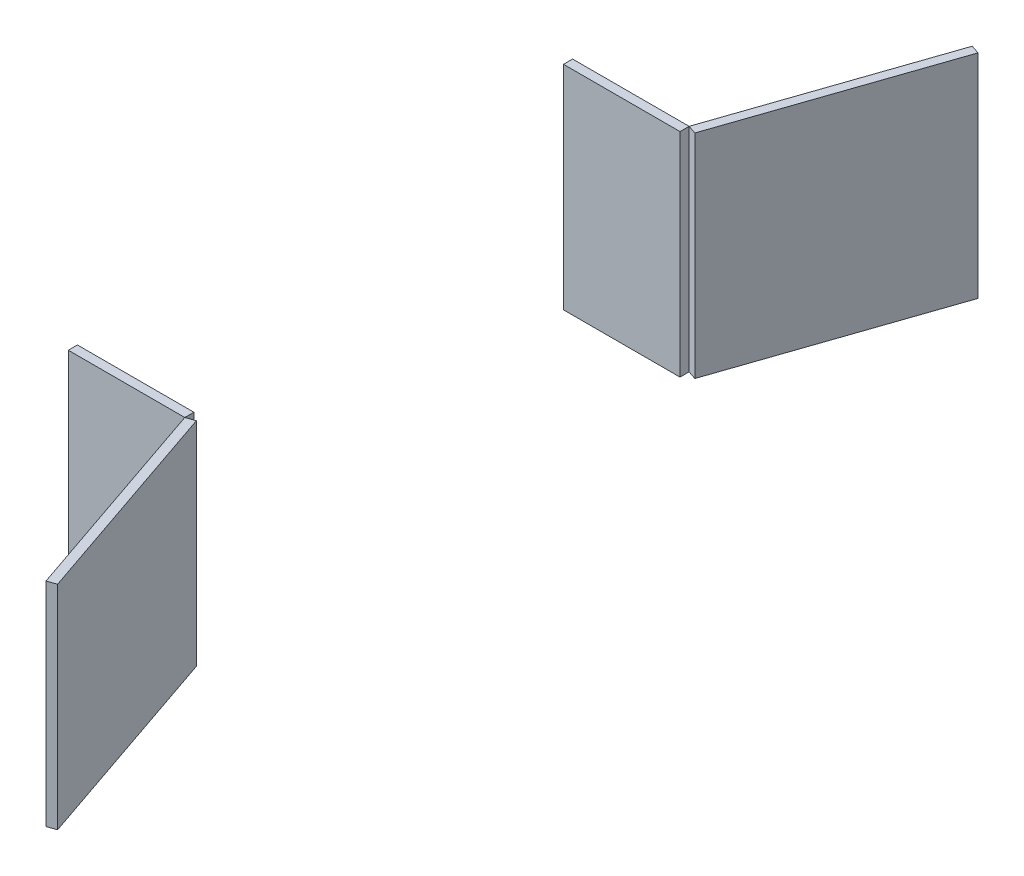
ISO-10303-21;
HEADER;
FILE_DESCRIPTION(('STEP AP214'),'2;1');
FILE_NAME('part.step','',(''),(''),'','','');
FILE_SCHEMA(('AUTOMOTIVE_DESIGN { 1 0 10303 214 1 1 1 1 }'));
ENDSEC;
DATA;
#1=APPLICATION_CONTEXT('core data for automotive mechanical design processes');
#2=APPLICATION_PROTOCOL_DEFINITION('international standard','automotive_design',2000,#1);
#3=PRODUCT_CONTEXT('',#1,'mechanical');
#4=PRODUCT('Part','Part','',(#3));
#5=PRODUCT_RELATED_PRODUCT_CATEGORY('part','',(#4));
#6=PRODUCT_DEFINITION_FORMATION('','',#4);
#7=PRODUCT_DEFINITION_CONTEXT('part definition',#1,'design');
#8=PRODUCT_DEFINITION('design','',#6,#7);
#9=PRODUCT_DEFINITION_SHAPE('','',#8);
#10=(LENGTH_UNIT() NAMED_UNIT(*) SI_UNIT(.MILLI.,.METRE.));
#11=(NAMED_UNIT(*) PLANE_ANGLE_UNIT() SI_UNIT($,.RADIAN.));
#12=(NAMED_UNIT(*) SI_UNIT($,.STERADIAN.) SOLID_ANGLE_UNIT());
#13=UNCERTAINTY_MEASURE_WITH_UNIT(LENGTH_MEASURE(1.E-05),#10,'distance_accuracy_value','');
#14=(GEOMETRIC_REPRESENTATION_CONTEXT(3) GLOBAL_UNCERTAINTY_ASSIGNED_CONTEXT((#13)) GLOBAL_UNIT_ASSIGNED_CONTEXT((#10,
#11,#12)) REPRESENTATION_CONTEXT('',''));
#15=CARTESIAN_POINT('',(0.,0.,0.));
#16=DIRECTION('',(0.,0.,1.));
#17=DIRECTION('',(1.,0.,0.));
#18=AXIS2_PLACEMENT_3D('',#15,#16,#17);
#19=CARTESIAN_POINT('',(-22.5855543490904,70.,-7.72827847580449));
#20=DIRECTION('',(0.946142923389947,0.,0.323749237094274));
#21=DIRECTION('',(0.323749237094274,0.,-0.946142923389947));
#22=AXIS2_PLACEMENT_3D('',#19,#20,#21);
#23=PLANE('',#22);
#24=DIRECTION('',(-0.323749237094274,0.,0.946142923389947));
#25=VECTOR('',#24,1.);
#26=CARTESIAN_POINT('',(-22.5855543490904,0.,-7.72827847580449));
#27=LINE('',#26,#25);
#28=CARTESIAN_POINT('',(26.6026867489092,0.,-151.478752288717));
#29=VERTEX_POINT('',#28);
#30=CARTESIAN_POINT('',(2.83842877016985,0.,-82.0287522887172));
#31=VERTEX_POINT('',#30);
#32=EDGE_CURVE('E163',#29,#31,#27,.T.);
#33=ORIENTED_EDGE('',*,*,#32,.F.);
#34=DIRECTION('',(0.,-1.,0.));
#35=VECTOR('',#34,1.);
#36=CARTESIAN_POINT('',(26.6026867489092,70.,-151.478752288717));
#37=LINE('',#36,#35);
#38=CARTESIAN_POINT('',(26.6026867489092,70.,-151.478752288717));
#39=VERTEX_POINT('',#38);
#40=EDGE_CURVE('E13',#39,#29,#37,.T.);
#41=ORIENTED_EDGE('',*,*,#40,.F.);
#42=DIRECTION('',(-0.323749237094274,0.,0.946142923389947));
#43=VECTOR('',#42,1.);
#44=CARTESIAN_POINT('',(-22.5855543490904,70.,-7.72827847580449));
#45=LINE('',#44,#43);
#46=CARTESIAN_POINT('',(2.83842877016985,70.,-82.0287522887172));
#47=VERTEX_POINT('',#46);
#48=EDGE_CURVE('E157',#39,#47,#45,.T.);
#49=ORIENTED_EDGE('',*,*,#48,.T.);
#50=DIRECTION('',(0.,-1.,0.));
#51=VECTOR('',#50,1.);
#52=CARTESIAN_POINT('',(2.83842877016985,70.,-82.0287522887172));
#53=LINE('',#52,#51);
#54=EDGE_CURVE('E138',#47,#31,#53,.T.);
#55=ORIENTED_EDGE('',*,*,#54,.T.);
#56=EDGE_LOOP('',(#33,#41,#49,#55));
#57=FACE_BOUND('',#56,.T.);
#58=ADVANCED_FACE('F100',(#57),#23,.T.);
#59=CARTESIAN_POINT('',(49.1882410979995,70.,-143.750473812913));
#60=DIRECTION('',(0.323749237094273,0.,-0.946142923389948));
#61=DIRECTION('',(-0.946142923389948,0.,-0.323749237094273));
#62=AXIS2_PLACEMENT_3D('',#59,#60,#61);
#63=PLANE('',#62);
#64=DIRECTION('',(0.946142923389948,0.,0.323749237094273));
#65=VECTOR('',#64,1.);
#66=CARTESIAN_POINT('',(49.1882410979995,0.,-143.750473812913));
#67=LINE('',#66,#65);
#68=CARTESIAN_POINT('',(23.7642579787393,0.,-152.45));
#69=VERTEX_POINT('',#68);
#70=EDGE_CURVE('E151',#69,#29,#67,.T.);
#71=ORIENTED_EDGE('',*,*,#70,.F.);
#72=DIRECTION('',(0.,-1.,0.));
#73=VECTOR('',#72,1.);
#74=CARTESIAN_POINT('',(23.7642579787393,70.,-152.45));
#75=LINE('',#74,#73);
#76=CARTESIAN_POINT('',(23.7642579787393,70.,-152.45));
#77=VERTEX_POINT('',#76);
#78=EDGE_CURVE('E108',#77,#69,#75,.T.);
#79=ORIENTED_EDGE('',*,*,#78,.F.);
#80=DIRECTION('',(0.946142923389948,0.,0.323749237094273));
#81=VECTOR('',#80,1.);
#82=CARTESIAN_POINT('',(49.1882410979995,70.,-143.750473812913));
#83=LINE('',#82,#81);
#84=EDGE_CURVE('E149',#77,#39,#83,.T.);
#85=ORIENTED_EDGE('',*,*,#84,.T.);
#86=ORIENTED_EDGE('',*,*,#40,.T.);
#87=EDGE_LOOP('',(#71,#79,#85,#86));
#88=FACE_BOUND('',#87,.T.);
#89=ADVANCED_FACE('F147',(#88),#63,.T.);
#90=CARTESIAN_POINT('',(-25.4239831192602,70.,-8.69952618708731));
#91=DIRECTION('',(0.946142923389947,0.,0.323749237094274));
#92=DIRECTION('',(0.323749237094274,0.,-0.946142923389947));
#93=AXIS2_PLACEMENT_3D('',#90,#91,#92);
#94=PLANE('',#93);
#95=DIRECTION('',(-0.323749237094274,0.,0.946142923389947));
#96=VECTOR('',#95,1.);
#97=CARTESIAN_POINT('',(-25.4239831192602,0.,-8.69952618708731));
#98=LINE('',#97,#96);
#99=CARTESIAN_POINT('',(0.,0.,-83.));
#100=VERTEX_POINT('',#99);
#101=EDGE_CURVE('E131',#69,#100,#98,.T.);
#102=ORIENTED_EDGE('',*,*,#101,.T.);
#103=DIRECTION('',(0.,-1.,0.));
#104=VECTOR('',#103,1.);
#105=CARTESIAN_POINT('',(0.,70.,-83.));
#106=LINE('',#105,#104);
#107=CARTESIAN_POINT('',(0.,70.,-83.));
#108=VERTEX_POINT('',#107);
#109=EDGE_CURVE('E152',#108,#100,#106,.T.);
#110=ORIENTED_EDGE('',*,*,#109,.F.);
#111=DIRECTION('',(-0.323749237094274,0.,0.946142923389947));
#112=VECTOR('',#111,1.);
#113=CARTESIAN_POINT('',(-25.4239831192602,70.,-8.69952618708731));
#114=LINE('',#113,#112);
#115=EDGE_CURVE('E153',#77,#108,#114,.T.);
#116=ORIENTED_EDGE('',*,*,#115,.F.);
#117=ORIENTED_EDGE('',*,*,#78,.T.);
#118=EDGE_LOOP('',(#102,#110,#116,#117));
#119=FACE_BOUND('',#118,.T.);
#120=ADVANCED_FACE('F154',(#119),#94,.F.);
#121=CARTESIAN_POINT('',(25.4239831192599,70.,-74.300473812913));
#122=DIRECTION('',(0.323749237094269,0.,-0.946142923389949));
#123=DIRECTION('',(-0.946142923389949,0.,-0.323749237094269));
#124=AXIS2_PLACEMENT_3D('',#121,#122,#123);
#125=PLANE('',#124);
#126=DIRECTION('',(0.946142923389949,0.,0.323749237094269));
#127=VECTOR('',#126,1.);
#128=CARTESIAN_POINT('',(25.4239831192599,0.,-74.300473812913));
#129=LINE('',#128,#127);
#130=EDGE_CURVE('E159',#100,#31,#129,.T.);
#131=ORIENTED_EDGE('',*,*,#130,.T.);
#132=ORIENTED_EDGE('',*,*,#54,.F.);
#133=DIRECTION('',(0.946142923389949,0.,0.323749237094269));
#134=VECTOR('',#133,1.);
#135=CARTESIAN_POINT('',(25.4239831192599,70.,-74.300473812913));
#136=LINE('',#135,#134);
#137=EDGE_CURVE('E116',#108,#47,#136,.T.);
#138=ORIENTED_EDGE('',*,*,#137,.F.);
#139=ORIENTED_EDGE('',*,*,#109,.T.);
#140=EDGE_LOOP('',(#131,#132,#138,#139));
#141=FACE_BOUND('',#140,.T.);
#142=ADVANCED_FACE('F172',(#141),#125,.F.);
#143=CARTESIAN_POINT('',(0.,70.,0.));
#144=DIRECTION('',(0.,1.,0.));
#145=DIRECTION('',(0.,0.,1.));
#146=AXIS2_PLACEMENT_3D('',#143,#144,#145);
#147=PLANE('',#146);
#148=ORIENTED_EDGE('',*,*,#48,.F.);
#149=ORIENTED_EDGE('',*,*,#84,.F.);
#150=ORIENTED_EDGE('',*,*,#115,.T.);
#151=ORIENTED_EDGE('',*,*,#137,.T.);
#152=EDGE_LOOP('',(#148,#149,#150,#151));
#153=FACE_BOUND('',#152,.T.);
#154=ADVANCED_FACE('F156',(#153),#147,.T.);
#155=CARTESIAN_POINT('',(0.,0.,0.));
#156=DIRECTION('',(0.,1.,0.));
#157=DIRECTION('',(0.,0.,1.));
#158=AXIS2_PLACEMENT_3D('',#155,#156,#157);
#159=PLANE('',#158);
#160=ORIENTED_EDGE('',*,*,#32,.T.);
#161=ORIENTED_EDGE('',*,*,#130,.F.);
#162=ORIENTED_EDGE('',*,*,#101,.F.);
#163=ORIENTED_EDGE('',*,*,#70,.T.);
#164=EDGE_LOOP('',(#160,#161,#162,#163));
#165=FACE_BOUND('',#164,.T.);
#166=ADVANCED_FACE('F174',(#165),#159,.F.);
#167=CLOSED_SHELL('',(#58,#89,#120,#142,#154,#166));
#168=MANIFOLD_SOLID_BREP('B2',#167);
#169=CARTESIAN_POINT('',(-4.71609870983756E-13,70.,0.));
#170=DIRECTION('',(1.,0.,0.));
#171=DIRECTION('',(0.,0.,-1.));
#172=AXIS2_PLACEMENT_3D('',#169,#170,#171);
#173=PLANE('',#172);
#174=DIRECTION('',(0.,0.,1.));
#175=VECTOR('',#174,1.);
#176=CARTESIAN_POINT('',(-4.71609870983756E-13,0.,0.));
#177=LINE('',#176,#175);
#178=CARTESIAN_POINT('',(0.,0.,-83.));
#179=VERTEX_POINT('',#178);
#180=CARTESIAN_POINT('',(0.,0.,-80.));
#181=VERTEX_POINT('',#180);
#182=EDGE_CURVE('E297',#179,#181,#177,.T.);
#183=ORIENTED_EDGE('',*,*,#182,.F.);
#184=DIRECTION('',(0.,-1.,0.));
#185=VECTOR('',#184,1.);
#186=CARTESIAN_POINT('',(0.,70.,-83.));
#187=LINE('',#186,#185);
#188=CARTESIAN_POINT('',(0.,70.,-83.));
#189=VERTEX_POINT('',#188);
#190=EDGE_CURVE('E98',#189,#179,#187,.T.);
#191=ORIENTED_EDGE('',*,*,#190,.F.);
#192=DIRECTION('',(0.,0.,1.));
#193=VECTOR('',#192,1.);
#194=CARTESIAN_POINT('',(-4.71609870983756E-13,70.,0.));
#195=LINE('',#194,#193);
#196=CARTESIAN_POINT('',(0.,70.,-80.));
#197=VERTEX_POINT('',#196);
#198=EDGE_CURVE('E291',#189,#197,#195,.T.);
#199=ORIENTED_EDGE('',*,*,#198,.T.);
#200=DIRECTION('',(0.,-1.,0.));
#201=VECTOR('',#200,1.);
#202=CARTESIAN_POINT('',(0.,70.,-80.));
#203=LINE('',#202,#201);
#204=EDGE_CURVE('E272',#197,#181,#203,.T.);
#205=ORIENTED_EDGE('',*,*,#204,.T.);
#206=EDGE_LOOP('',(#183,#191,#199,#205));
#207=FACE_BOUND('',#206,.T.);
#208=ADVANCED_FACE('F234',(#207),#173,.T.);
#209=CARTESIAN_POINT('',(0.,70.,-83.));
#210=DIRECTION('',(0.,0.,-1.));
#211=DIRECTION('',(-1.,0.,0.));
#212=AXIS2_PLACEMENT_3D('',#209,#210,#211);
#213=PLANE('',#212);
#214=DIRECTION('',(1.,0.,0.));
#215=VECTOR('',#214,1.);
#216=CARTESIAN_POINT('',(0.,0.,-83.));
#217=LINE('',#216,#215);
#218=CARTESIAN_POINT('',(-38.357380244156,0.,-83.));
#219=VERTEX_POINT('',#218);
#220=EDGE_CURVE('E285',#219,#179,#217,.T.);
#221=ORIENTED_EDGE('',*,*,#220,.F.);
#222=DIRECTION('',(0.,-1.,0.));
#223=VECTOR('',#222,1.);
#224=CARTESIAN_POINT('',(-38.357380244156,70.,-83.));
#225=LINE('',#224,#223);
#226=CARTESIAN_POINT('',(-38.357380244156,70.,-83.));
#227=VERTEX_POINT('',#226);
#228=EDGE_CURVE('E242',#227,#219,#225,.T.);
#229=ORIENTED_EDGE('',*,*,#228,.F.);
#230=DIRECTION('',(1.,0.,0.));
#231=VECTOR('',#230,1.);
#232=CARTESIAN_POINT('',(0.,70.,-83.));
#233=LINE('',#232,#231);
#234=EDGE_CURVE('E283',#227,#189,#233,.T.);
#235=ORIENTED_EDGE('',*,*,#234,.T.);
#236=ORIENTED_EDGE('',*,*,#190,.T.);
#237=EDGE_LOOP('',(#221,#229,#235,#236));
#238=FACE_BOUND('',#237,.T.);
#239=ADVANCED_FACE('F281',(#238),#213,.T.);
#240=CARTESIAN_POINT('',(-38.3573802441562,70.,0.));
#241=DIRECTION('',(1.,0.,0.));
#242=DIRECTION('',(0.,0.,-1.));
#243=AXIS2_PLACEMENT_3D('',#240,#241,#242);
#244=PLANE('',#243);
#245=DIRECTION('',(0.,0.,1.));
#246=VECTOR('',#245,1.);
#247=CARTESIAN_POINT('',(-38.3573802441562,0.,0.));
#248=LINE('',#247,#246);
#249=CARTESIAN_POINT('',(-38.357380244156,0.,-80.));
#250=VERTEX_POINT('',#249);
#251=EDGE_CURVE('E265',#219,#250,#248,.T.);
#252=ORIENTED_EDGE('',*,*,#251,.T.);
#253=DIRECTION('',(0.,-1.,0.));
#254=VECTOR('',#253,1.);
#255=CARTESIAN_POINT('',(-38.357380244156,70.,-80.));
#256=LINE('',#255,#254);
#257=CARTESIAN_POINT('',(-38.357380244156,70.,-80.));
#258=VERTEX_POINT('',#257);
#259=EDGE_CURVE('E286',#258,#250,#256,.T.);
#260=ORIENTED_EDGE('',*,*,#259,.F.);
#261=DIRECTION('',(0.,0.,1.));
#262=VECTOR('',#261,1.);
#263=CARTESIAN_POINT('',(-38.3573802441562,70.,0.));
#264=LINE('',#263,#262);
#265=EDGE_CURVE('E287',#227,#258,#264,.T.);
#266=ORIENTED_EDGE('',*,*,#265,.F.);
#267=ORIENTED_EDGE('',*,*,#228,.T.);
#268=EDGE_LOOP('',(#252,#260,#266,#267));
#269=FACE_BOUND('',#268,.T.);
#270=ADVANCED_FACE('F288',(#269),#244,.F.);
#271=CARTESIAN_POINT('',(0.,70.,-80.));
#272=DIRECTION('',(0.,0.,-1.));
#273=DIRECTION('',(-1.,0.,0.));
#274=AXIS2_PLACEMENT_3D('',#271,#272,#273);
#275=PLANE('',#274);
#276=DIRECTION('',(1.,0.,0.));
#277=VECTOR('',#276,1.);
#278=CARTESIAN_POINT('',(0.,0.,-80.));
#279=LINE('',#278,#277);
#280=EDGE_CURVE('E293',#250,#181,#279,.T.);
#281=ORIENTED_EDGE('',*,*,#280,.T.);
#282=ORIENTED_EDGE('',*,*,#204,.F.);
#283=DIRECTION('',(1.,0.,0.));
#284=VECTOR('',#283,1.);
#285=CARTESIAN_POINT('',(0.,70.,-80.));
#286=LINE('',#285,#284);
#287=EDGE_CURVE('E250',#258,#197,#286,.T.);
#288=ORIENTED_EDGE('',*,*,#287,.F.);
#289=ORIENTED_EDGE('',*,*,#259,.T.);
#290=EDGE_LOOP('',(#281,#282,#288,#289));
#291=FACE_BOUND('',#290,.T.);
#292=ADVANCED_FACE('F306',(#291),#275,.F.);
#293=CARTESIAN_POINT('',(0.,70.,0.));
#294=DIRECTION('',(0.,1.,0.));
#295=DIRECTION('',(0.,0.,1.));
#296=AXIS2_PLACEMENT_3D('',#293,#294,#295);
#297=PLANE('',#296);
#298=ORIENTED_EDGE('',*,*,#198,.F.);
#299=ORIENTED_EDGE('',*,*,#234,.F.);
#300=ORIENTED_EDGE('',*,*,#265,.T.);
#301=ORIENTED_EDGE('',*,*,#287,.T.);
#302=EDGE_LOOP('',(#298,#299,#300,#301));
#303=FACE_BOUND('',#302,.T.);
#304=ADVANCED_FACE('F290',(#303),#297,.T.);
#305=CARTESIAN_POINT('',(0.,0.,0.));
#306=DIRECTION('',(0.,1.,0.));
#307=DIRECTION('',(0.,0.,1.));
#308=AXIS2_PLACEMENT_3D('',#305,#306,#307);
#309=PLANE('',#308);
#310=ORIENTED_EDGE('',*,*,#182,.T.);
#311=ORIENTED_EDGE('',*,*,#280,.F.);
#312=ORIENTED_EDGE('',*,*,#251,.F.);
#313=ORIENTED_EDGE('',*,*,#220,.T.);
#314=EDGE_LOOP('',(#310,#311,#312,#313));
#315=FACE_BOUND('',#314,.T.);
#316=ADVANCED_FACE('F308',(#315),#309,.F.);
#317=CLOSED_SHELL('',(#208,#239,#270,#292,#304,#316));
#318=MANIFOLD_SOLID_BREP('B7',#317);
#319=CARTESIAN_POINT('',(49.1882410979994,70.,143.750473812913));
#320=DIRECTION('',(0.323749237094272,0.,0.946142923389948));
#321=DIRECTION('',(0.946142923389948,0.,-0.323749237094272));
#322=AXIS2_PLACEMENT_3D('',#319,#320,#321);
#323=PLANE('',#322);
#324=DIRECTION('',(-0.946142923389948,0.,0.323749237094272));
#325=VECTOR('',#324,1.);
#326=CARTESIAN_POINT('',(49.1882410979994,0.,143.750473812913));
#327=LINE('',#326,#325);
#328=CARTESIAN_POINT('',(26.6026867489092,0.,151.478752288717));
#329=VERTEX_POINT('',#328);
#330=CARTESIAN_POINT('',(23.7642579787393,0.,152.45));
#331=VERTEX_POINT('',#330);
#332=EDGE_CURVE('E430',#329,#331,#327,.T.);
#333=ORIENTED_EDGE('',*,*,#332,.F.);
#334=DIRECTION('',(0.,-1.,0.));
#335=VECTOR('',#334,1.);
#336=CARTESIAN_POINT('',(26.6026867489092,70.,151.478752288717));
#337=LINE('',#336,#335);
#338=CARTESIAN_POINT('',(26.6026867489092,70.,151.478752288717));
#339=VERTEX_POINT('',#338);
#340=EDGE_CURVE('E232',#339,#329,#337,.T.);
#341=ORIENTED_EDGE('',*,*,#340,.F.);
#342=DIRECTION('',(-0.946142923389948,0.,0.323749237094272));
#343=VECTOR('',#342,1.);
#344=CARTESIAN_POINT('',(49.1882410979994,70.,143.750473812913));
#345=LINE('',#344,#343);
#346=CARTESIAN_POINT('',(23.7642579787393,70.,152.45));
#347=VERTEX_POINT('',#346);
#348=EDGE_CURVE('E424',#339,#347,#345,.T.);
#349=ORIENTED_EDGE('',*,*,#348,.T.);
#350=DIRECTION('',(0.,-1.,0.));
#351=VECTOR('',#350,1.);
#352=CARTESIAN_POINT('',(23.7642579787393,70.,152.45));
#353=LINE('',#352,#351);
#354=EDGE_CURVE('E405',#347,#331,#353,.T.);
#355=ORIENTED_EDGE('',*,*,#354,.T.);
#356=EDGE_LOOP('',(#333,#341,#349,#355));
#357=FACE_BOUND('',#356,.T.);
#358=ADVANCED_FACE('F367',(#357),#323,.T.);
#359=CARTESIAN_POINT('',(-22.5855543490903,70.,7.72827847580447));
#360=DIRECTION('',(0.946142923389947,0.,-0.323749237094274));
#361=DIRECTION('',(-0.323749237094274,0.,-0.946142923389948));
#362=AXIS2_PLACEMENT_3D('',#359,#360,#361);
#363=PLANE('',#362);
#364=DIRECTION('',(0.323749237094274,0.,0.946142923389948));
#365=VECTOR('',#364,1.);
#366=CARTESIAN_POINT('',(-22.5855543490903,0.,7.72827847580447));
#367=LINE('',#366,#365);
#368=CARTESIAN_POINT('',(2.83842877016988,0.,82.0287522887172));
#369=VERTEX_POINT('',#368);
#370=EDGE_CURVE('E418',#369,#329,#367,.T.);
#371=ORIENTED_EDGE('',*,*,#370,.F.);
#372=DIRECTION('',(0.,-1.,0.));
#373=VECTOR('',#372,1.);
#374=CARTESIAN_POINT('',(2.83842877016988,70.,82.0287522887172));
#375=LINE('',#374,#373);
#376=CARTESIAN_POINT('',(2.83842877016988,70.,82.0287522887172));
#377=VERTEX_POINT('',#376);
#378=EDGE_CURVE('E375',#377,#369,#375,.T.);
#379=ORIENTED_EDGE('',*,*,#378,.F.);
#380=DIRECTION('',(0.323749237094274,0.,0.946142923389948));
#381=VECTOR('',#380,1.);
#382=CARTESIAN_POINT('',(-22.5855543490903,70.,7.72827847580447));
#383=LINE('',#382,#381);
#384=EDGE_CURVE('E416',#377,#339,#383,.T.);
#385=ORIENTED_EDGE('',*,*,#384,.T.);
#386=ORIENTED_EDGE('',*,*,#340,.T.);
#387=EDGE_LOOP('',(#371,#379,#385,#386));
#388=FACE_BOUND('',#387,.T.);
#389=ADVANCED_FACE('F414',(#388),#363,.T.);
#390=CARTESIAN_POINT('',(25.4239831192605,70.,74.3004738129125));
#391=DIRECTION('',(0.323749237094277,0.,0.946142923389946));
#392=DIRECTION('',(0.946142923389946,0.,-0.323749237094277));
#393=AXIS2_PLACEMENT_3D('',#390,#391,#392);
#394=PLANE('',#393);
#395=DIRECTION('',(-0.946142923389946,0.,0.323749237094277));
#396=VECTOR('',#395,1.);
#397=CARTESIAN_POINT('',(25.4239831192605,0.,74.3004738129125));
#398=LINE('',#397,#396);
#399=CARTESIAN_POINT('',(0.,0.,83.));
#400=VERTEX_POINT('',#399);
#401=EDGE_CURVE('E398',#369,#400,#398,.T.);
#402=ORIENTED_EDGE('',*,*,#401,.T.);
#403=DIRECTION('',(0.,-1.,0.));
#404=VECTOR('',#403,1.);
#405=CARTESIAN_POINT('',(0.,70.,83.));
#406=LINE('',#405,#404);
#407=CARTESIAN_POINT('',(0.,70.,83.));
#408=VERTEX_POINT('',#407);
#409=EDGE_CURVE('E419',#408,#400,#406,.T.);
#410=ORIENTED_EDGE('',*,*,#409,.F.);
#411=DIRECTION('',(-0.946142923389946,0.,0.323749237094277));
#412=VECTOR('',#411,1.);
#413=CARTESIAN_POINT('',(25.4239831192605,70.,74.3004738129125));
#414=LINE('',#413,#412);
#415=EDGE_CURVE('E420',#377,#408,#414,.T.);
#416=ORIENTED_EDGE('',*,*,#415,.F.);
#417=ORIENTED_EDGE('',*,*,#378,.T.);
#418=EDGE_LOOP('',(#402,#410,#416,#417));
#419=FACE_BOUND('',#418,.T.);
#420=ADVANCED_FACE('F421',(#419),#394,.F.);
#421=CARTESIAN_POINT('',(-25.4239831192602,70.,8.69952618708729));
#422=DIRECTION('',(0.946142923389947,0.,-0.323749237094274));
#423=DIRECTION('',(-0.323749237094274,0.,-0.946142923389948));
#424=AXIS2_PLACEMENT_3D('',#421,#422,#423);
#425=PLANE('',#424);
#426=DIRECTION('',(0.323749237094274,0.,0.946142923389948));
#427=VECTOR('',#426,1.);
#428=CARTESIAN_POINT('',(-25.4239831192602,0.,8.69952618708729));
#429=LINE('',#428,#427);
#430=EDGE_CURVE('E426',#400,#331,#429,.T.);
#431=ORIENTED_EDGE('',*,*,#430,.T.);
#432=ORIENTED_EDGE('',*,*,#354,.F.);
#433=DIRECTION('',(0.323749237094274,0.,0.946142923389948));
#434=VECTOR('',#433,1.);
#435=CARTESIAN_POINT('',(-25.4239831192602,70.,8.69952618708729));
#436=LINE('',#435,#434);
#437=EDGE_CURVE('E383',#408,#347,#436,.T.);
#438=ORIENTED_EDGE('',*,*,#437,.F.);
#439=ORIENTED_EDGE('',*,*,#409,.T.);
#440=EDGE_LOOP('',(#431,#432,#438,#439));
#441=FACE_BOUND('',#440,.T.);
#442=ADVANCED_FACE('F439',(#441),#425,.F.);
#443=CARTESIAN_POINT('',(0.,70.,0.));
#444=DIRECTION('',(0.,1.,0.));
#445=DIRECTION('',(0.,0.,1.));
#446=AXIS2_PLACEMENT_3D('',#443,#444,#445);
#447=PLANE('',#446);
#448=ORIENTED_EDGE('',*,*,#348,.F.);
#449=ORIENTED_EDGE('',*,*,#384,.F.);
#450=ORIENTED_EDGE('',*,*,#415,.T.);
#451=ORIENTED_EDGE('',*,*,#437,.T.);
#452=EDGE_LOOP('',(#448,#449,#450,#451));
#453=FACE_BOUND('',#452,.T.);
#454=ADVANCED_FACE('F423',(#453),#447,.T.);
#455=CARTESIAN_POINT('',(0.,0.,0.));
#456=DIRECTION('',(0.,1.,0.));
#457=DIRECTION('',(0.,0.,1.));
#458=AXIS2_PLACEMENT_3D('',#455,#456,#457);
#459=PLANE('',#458);
#460=ORIENTED_EDGE('',*,*,#332,.T.);
#461=ORIENTED_EDGE('',*,*,#430,.F.);
#462=ORIENTED_EDGE('',*,*,#401,.F.);
#463=ORIENTED_EDGE('',*,*,#370,.T.);
#464=EDGE_LOOP('',(#460,#461,#462,#463));
#465=FACE_BOUND('',#464,.T.);
#466=ADVANCED_FACE('F441',(#465),#459,.F.);
#467=CLOSED_SHELL('',(#358,#389,#420,#442,#454,#466));
#468=MANIFOLD_SOLID_BREP('B92',#467);
#469=CARTESIAN_POINT('',(-4.71609870983754E-13,70.,0.));
#470=DIRECTION('',(1.,0.,0.));
#471=DIRECTION('',(0.,0.,-1.));
#472=AXIS2_PLACEMENT_3D('',#469,#470,#471);
#473=PLANE('',#472);
#474=DIRECTION('',(0.,0.,1.));
#475=VECTOR('',#474,1.);
#476=CARTESIAN_POINT('',(-4.71609870983754E-13,0.,0.));
#477=LINE('',#476,#475);
#478=CARTESIAN_POINT('',(0.,0.,80.));
#479=VERTEX_POINT('',#478);
#480=CARTESIAN_POINT('',(0.,0.,83.));
#481=VERTEX_POINT('',#480);
#482=EDGE_CURVE('E554',#479,#481,#477,.T.);
#483=ORIENTED_EDGE('',*,*,#482,.F.);
#484=DIRECTION('',(0.,-1.,0.));
#485=VECTOR('',#484,1.);
#486=CARTESIAN_POINT('',(0.,70.,80.));
#487=LINE('',#486,#485);
#488=CARTESIAN_POINT('',(0.,70.,80.));
#489=VERTEX_POINT('',#488);
#490=EDGE_CURVE('E365',#489,#479,#487,.T.);
#491=ORIENTED_EDGE('',*,*,#490,.F.);
#492=DIRECTION('',(0.,0.,1.));
#493=VECTOR('',#492,1.);
#494=CARTESIAN_POINT('',(-4.71609870983754E-13,70.,0.));
#495=LINE('',#494,#493);
#496=CARTESIAN_POINT('',(0.,70.,83.));
#497=VERTEX_POINT('',#496);
#498=EDGE_CURVE('E548',#489,#497,#495,.T.);
#499=ORIENTED_EDGE('',*,*,#498,.T.);
#500=DIRECTION('',(0.,-1.,0.));
#501=VECTOR('',#500,1.);
#502=CARTESIAN_POINT('',(0.,70.,83.));
#503=LINE('',#502,#501);
#504=EDGE_CURVE('E529',#497,#481,#503,.T.);
#505=ORIENTED_EDGE('',*,*,#504,.T.);
#506=EDGE_LOOP('',(#483,#491,#499,#505));
#507=FACE_BOUND('',#506,.T.);
#508=ADVANCED_FACE('F491',(#507),#473,.T.);
#509=CARTESIAN_POINT('',(0.,70.,80.));
#510=DIRECTION('',(0.,0.,-1.));
#511=DIRECTION('',(-1.,0.,0.));
#512=AXIS2_PLACEMENT_3D('',#509,#510,#511);
#513=PLANE('',#512);
#514=DIRECTION('',(1.,0.,0.));
#515=VECTOR('',#514,1.);
#516=CARTESIAN_POINT('',(0.,0.,80.));
#517=LINE('',#516,#515);
#518=CARTESIAN_POINT('',(-38.357380244156,0.,80.));
#519=VERTEX_POINT('',#518);
#520=EDGE_CURVE('E542',#519,#479,#517,.T.);
#521=ORIENTED_EDGE('',*,*,#520,.F.);
#522=DIRECTION('',(0.,-1.,0.));
#523=VECTOR('',#522,1.);
#524=CARTESIAN_POINT('',(-38.357380244156,70.,80.));
#525=LINE('',#524,#523);
#526=CARTESIAN_POINT('',(-38.357380244156,70.,80.));
#527=VERTEX_POINT('',#526);
#528=EDGE_CURVE('E499',#527,#519,#525,.T.);
#529=ORIENTED_EDGE('',*,*,#528,.F.);
#530=DIRECTION('',(1.,0.,0.));
#531=VECTOR('',#530,1.);
#532=CARTESIAN_POINT('',(0.,70.,80.));
#533=LINE('',#532,#531);
#534=EDGE_CURVE('E540',#527,#489,#533,.T.);
#535=ORIENTED_EDGE('',*,*,#534,.T.);
#536=ORIENTED_EDGE('',*,*,#490,.T.);
#537=EDGE_LOOP('',(#521,#529,#535,#536));
#538=FACE_BOUND('',#537,.T.);
#539=ADVANCED_FACE('F538',(#538),#513,.T.);
#540=CARTESIAN_POINT('',(-38.3573802441562,70.,0.));
#541=DIRECTION('',(1.,0.,0.));
#542=DIRECTION('',(0.,0.,-1.));
#543=AXIS2_PLACEMENT_3D('',#540,#541,#542);
#544=PLANE('',#543);
#545=DIRECTION('',(0.,0.,1.));
#546=VECTOR('',#545,1.);
#547=CARTESIAN_POINT('',(-38.3573802441562,0.,0.));
#548=LINE('',#547,#546);
#549=CARTESIAN_POINT('',(-38.357380244156,0.,83.));
#550=VERTEX_POINT('',#549);
#551=EDGE_CURVE('E522',#519,#550,#548,.T.);
#552=ORIENTED_EDGE('',*,*,#551,.T.);
#553=DIRECTION('',(0.,-1.,0.));
#554=VECTOR('',#553,1.);
#555=CARTESIAN_POINT('',(-38.357380244156,70.,83.));
#556=LINE('',#555,#554);
#557=CARTESIAN_POINT('',(-38.357380244156,70.,83.));
#558=VERTEX_POINT('',#557);
#559=EDGE_CURVE('E543',#558,#550,#556,.T.);
#560=ORIENTED_EDGE('',*,*,#559,.F.);
#561=DIRECTION('',(0.,0.,1.));
#562=VECTOR('',#561,1.);
#563=CARTESIAN_POINT('',(-38.3573802441562,70.,0.));
#564=LINE('',#563,#562);
#565=EDGE_CURVE('E544',#527,#558,#564,.T.);
#566=ORIENTED_EDGE('',*,*,#565,.F.);
#567=ORIENTED_EDGE('',*,*,#528,.T.);
#568=EDGE_LOOP('',(#552,#560,#566,#567));
#569=FACE_BOUND('',#568,.T.);
#570=ADVANCED_FACE('F545',(#569),#544,.F.);
#571=CARTESIAN_POINT('',(0.,70.,83.));
#572=DIRECTION('',(0.,0.,-1.));
#573=DIRECTION('',(-1.,0.,0.));
#574=AXIS2_PLACEMENT_3D('',#571,#572,#573);
#575=PLANE('',#574);
#576=DIRECTION('',(1.,0.,0.));
#577=VECTOR('',#576,1.);
#578=CARTESIAN_POINT('',(0.,0.,83.));
#579=LINE('',#578,#577);
#580=EDGE_CURVE('E550',#550,#481,#579,.T.);
#581=ORIENTED_EDGE('',*,*,#580,.T.);
#582=ORIENTED_EDGE('',*,*,#504,.F.);
#583=DIRECTION('',(1.,0.,0.));
#584=VECTOR('',#583,1.);
#585=CARTESIAN_POINT('',(0.,70.,83.));
#586=LINE('',#585,#584);
#587=EDGE_CURVE('E507',#558,#497,#586,.T.);
#588=ORIENTED_EDGE('',*,*,#587,.F.);
#589=ORIENTED_EDGE('',*,*,#559,.T.);
#590=EDGE_LOOP('',(#581,#582,#588,#589));
#591=FACE_BOUND('',#590,.T.);
#592=ADVANCED_FACE('F563',(#591),#575,.F.);
#593=CARTESIAN_POINT('',(0.,70.,0.));
#594=DIRECTION('',(0.,1.,0.));
#595=DIRECTION('',(0.,0.,1.));
#596=AXIS2_PLACEMENT_3D('',#593,#594,#595);
#597=PLANE('',#596);
#598=ORIENTED_EDGE('',*,*,#498,.F.);
#599=ORIENTED_EDGE('',*,*,#534,.F.);
#600=ORIENTED_EDGE('',*,*,#565,.T.);
#601=ORIENTED_EDGE('',*,*,#587,.T.);
#602=EDGE_LOOP('',(#598,#599,#600,#601));
#603=FACE_BOUND('',#602,.T.);
#604=ADVANCED_FACE('F547',(#603),#597,.T.);
#605=CARTESIAN_POINT('',(0.,0.,0.));
#606=DIRECTION('',(0.,1.,0.));
#607=DIRECTION('',(0.,0.,1.));
#608=AXIS2_PLACEMENT_3D('',#605,#606,#607);
#609=PLANE('',#608);
#610=ORIENTED_EDGE('',*,*,#482,.T.);
#611=ORIENTED_EDGE('',*,*,#580,.F.);
#612=ORIENTED_EDGE('',*,*,#551,.F.);
#613=ORIENTED_EDGE('',*,*,#520,.T.);
#614=EDGE_LOOP('',(#610,#611,#612,#613));
#615=FACE_BOUND('',#614,.T.);
#616=ADVANCED_FACE('F565',(#615),#609,.F.);
#617=CLOSED_SHELL('',(#508,#539,#570,#592,#604,#616));
#618=MANIFOLD_SOLID_BREP('B226',#617);
#619=ADVANCED_BREP_SHAPE_REPRESENTATION('',(#18,#168,#318,#468,#618),#14);
#620=SHAPE_DEFINITION_REPRESENTATION(#9,#619);
ENDSEC;
END-ISO-10303-21;
